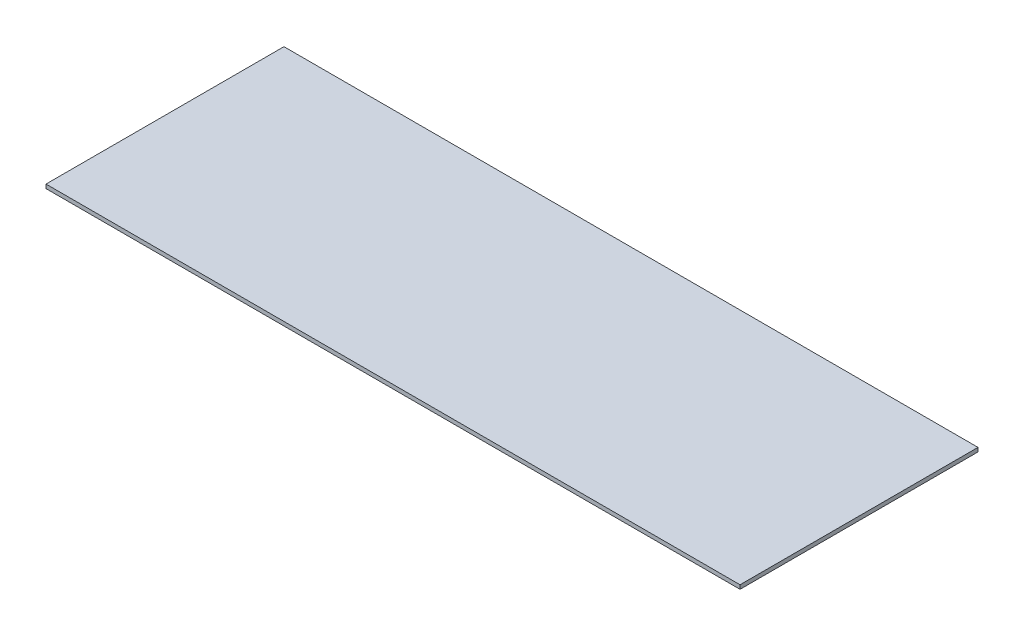
ISO-10303-21;
HEADER;
FILE_DESCRIPTION(('STEP AP214'),'2;1');
FILE_NAME('part.step','',(''),(''),'','','');
FILE_SCHEMA(('AUTOMOTIVE_DESIGN { 1 0 10303 214 1 1 1 1 }'));
ENDSEC;
DATA;
#1=APPLICATION_CONTEXT('core data for automotive mechanical design processes');
#2=APPLICATION_PROTOCOL_DEFINITION('international standard','automotive_design',2000,#1);
#3=PRODUCT_CONTEXT('',#1,'mechanical');
#4=PRODUCT('Part','Part','',(#3));
#5=PRODUCT_RELATED_PRODUCT_CATEGORY('part','',(#4));
#6=PRODUCT_DEFINITION_FORMATION('','',#4);
#7=PRODUCT_DEFINITION_CONTEXT('part definition',#1,'design');
#8=PRODUCT_DEFINITION('design','',#6,#7);
#9=PRODUCT_DEFINITION_SHAPE('','',#8);
#10=(LENGTH_UNIT() NAMED_UNIT(*) SI_UNIT(.MILLI.,.METRE.));
#11=(NAMED_UNIT(*) PLANE_ANGLE_UNIT() SI_UNIT($,.RADIAN.));
#12=(NAMED_UNIT(*) SI_UNIT($,.STERADIAN.) SOLID_ANGLE_UNIT());
#13=UNCERTAINTY_MEASURE_WITH_UNIT(LENGTH_MEASURE(1.E-05),#10,'distance_accuracy_value','');
#14=(GEOMETRIC_REPRESENTATION_CONTEXT(3) GLOBAL_UNCERTAINTY_ASSIGNED_CONTEXT((#13)) GLOBAL_UNIT_ASSIGNED_CONTEXT((#10,
#11,#12)) REPRESENTATION_CONTEXT('',''));
#15=CARTESIAN_POINT('',(0.,0.,0.));
#16=DIRECTION('',(0.,0.,1.));
#17=DIRECTION('',(1.,0.,0.));
#18=AXIS2_PLACEMENT_3D('',#15,#16,#17);
#19=CARTESIAN_POINT('',(-192.808988764045,2.,-60.3370786516853));
#20=DIRECTION('',(0.,0.,-1.));
#21=DIRECTION('',(-1.,0.,0.));
#22=AXIS2_PLACEMENT_3D('',#19,#20,#21);
#23=PLANE('',#22);
#24=DIRECTION('',(1.,0.,0.));
#25=VECTOR('',#24,1.);
#26=CARTESIAN_POINT('',(-192.808988764045,0.,-60.3370786516853));
#27=LINE('',#26,#25);
#28=CARTESIAN_POINT('',(-192.808988764045,0.,-60.3370786516853));
#29=VERTEX_POINT('',#28);
#30=CARTESIAN_POINT('',(157.191011235955,0.,-60.3370786516853));
#31=VERTEX_POINT('',#30);
#32=EDGE_CURVE('E102',#29,#31,#27,.T.);
#33=ORIENTED_EDGE('',*,*,#32,.F.);
#34=DIRECTION('',(0.,-1.,0.));
#35=VECTOR('',#34,1.);
#36=CARTESIAN_POINT('',(-192.808988764045,2.,-60.3370786516853));
#37=LINE('',#36,#35);
#38=CARTESIAN_POINT('',(-192.808988764045,2.,-60.3370786516853));
#39=VERTEX_POINT('',#38);
#40=EDGE_CURVE('E11',#39,#29,#37,.T.);
#41=ORIENTED_EDGE('',*,*,#40,.F.);
#42=DIRECTION('',(1.,0.,0.));
#43=VECTOR('',#42,1.);
#44=CARTESIAN_POINT('',(-192.808988764045,2.,-60.3370786516853));
#45=LINE('',#44,#43);
#46=CARTESIAN_POINT('',(157.191011235955,2.,-60.3370786516853));
#47=VERTEX_POINT('',#46);
#48=EDGE_CURVE('E97',#39,#47,#45,.T.);
#49=ORIENTED_EDGE('',*,*,#48,.T.);
#50=DIRECTION('',(0.,-1.,0.));
#51=VECTOR('',#50,1.);
#52=CARTESIAN_POINT('',(157.191011235955,2.,-60.3370786516853));
#53=LINE('',#52,#51);
#54=EDGE_CURVE('E40',#47,#31,#53,.T.);
#55=ORIENTED_EDGE('',*,*,#54,.T.);
#56=EDGE_LOOP('',(#33,#41,#49,#55));
#57=FACE_BOUND('',#56,.T.);
#58=ADVANCED_FACE('F37',(#57),#23,.T.);
#59=CARTESIAN_POINT('',(-192.808988764045,2.,-60.3370786516853));
#60=DIRECTION('',(1.,0.,0.));
#61=DIRECTION('',(0.,0.,-1.));
#62=AXIS2_PLACEMENT_3D('',#59,#60,#61);
#63=PLANE('',#62);
#64=DIRECTION('',(0.,0.,1.));
#65=VECTOR('',#64,1.);
#66=CARTESIAN_POINT('',(-192.808988764045,0.,-60.3370786516853));
#67=LINE('',#66,#65);
#68=CARTESIAN_POINT('',(-192.808988764045,0.,59.6629213483147));
#69=VERTEX_POINT('',#68);
#70=EDGE_CURVE('E70',#29,#69,#67,.T.);
#71=ORIENTED_EDGE('',*,*,#70,.T.);
#72=DIRECTION('',(0.,-1.,0.));
#73=VECTOR('',#72,1.);
#74=CARTESIAN_POINT('',(-192.808988764045,2.,59.6629213483147));
#75=LINE('',#74,#73);
#76=CARTESIAN_POINT('',(-192.808988764045,2.,59.6629213483147));
#77=VERTEX_POINT('',#76);
#78=EDGE_CURVE('E46',#77,#69,#75,.T.);
#79=ORIENTED_EDGE('',*,*,#78,.F.);
#80=DIRECTION('',(0.,0.,1.));
#81=VECTOR('',#80,1.);
#82=CARTESIAN_POINT('',(-192.808988764045,2.,-60.3370786516853));
#83=LINE('',#82,#81);
#84=EDGE_CURVE('E87',#39,#77,#83,.T.);
#85=ORIENTED_EDGE('',*,*,#84,.F.);
#86=ORIENTED_EDGE('',*,*,#40,.T.);
#87=EDGE_LOOP('',(#71,#79,#85,#86));
#88=FACE_BOUND('',#87,.T.);
#89=ADVANCED_FACE('F112',(#88),#63,.F.);
#90=CARTESIAN_POINT('',(-192.808988764045,2.,59.6629213483147));
#91=DIRECTION('',(0.,0.,-1.));
#92=DIRECTION('',(-1.,0.,0.));
#93=AXIS2_PLACEMENT_3D('',#90,#91,#92);
#94=PLANE('',#93);
#95=DIRECTION('',(1.,0.,0.));
#96=VECTOR('',#95,1.);
#97=CARTESIAN_POINT('',(-192.808988764045,0.,59.6629213483147));
#98=LINE('',#97,#96);
#99=CARTESIAN_POINT('',(157.191011235955,0.,59.6629213483147));
#100=VERTEX_POINT('',#99);
#101=EDGE_CURVE('E94',#69,#100,#98,.T.);
#102=ORIENTED_EDGE('',*,*,#101,.T.);
#103=DIRECTION('',(0.,-1.,0.));
#104=VECTOR('',#103,1.);
#105=CARTESIAN_POINT('',(157.191011235955,2.,59.6629213483147));
#106=LINE('',#105,#104);
#107=CARTESIAN_POINT('',(157.191011235955,2.,59.6629213483147));
#108=VERTEX_POINT('',#107);
#109=EDGE_CURVE('E91',#108,#100,#106,.T.);
#110=ORIENTED_EDGE('',*,*,#109,.F.);
#111=DIRECTION('',(1.,0.,0.));
#112=VECTOR('',#111,1.);
#113=CARTESIAN_POINT('',(-192.808988764045,2.,59.6629213483147));
#114=LINE('',#113,#112);
#115=EDGE_CURVE('E82',#77,#108,#114,.T.);
#116=ORIENTED_EDGE('',*,*,#115,.F.);
#117=ORIENTED_EDGE('',*,*,#78,.T.);
#118=EDGE_LOOP('',(#102,#110,#116,#117));
#119=FACE_BOUND('',#118,.T.);
#120=ADVANCED_FACE('F92',(#119),#94,.F.);
#121=CARTESIAN_POINT('',(157.191011235955,2.,-60.3370786516853));
#122=DIRECTION('',(1.,0.,0.));
#123=DIRECTION('',(0.,0.,-1.));
#124=AXIS2_PLACEMENT_3D('',#121,#122,#123);
#125=PLANE('',#124);
#126=DIRECTION('',(0.,0.,1.));
#127=VECTOR('',#126,1.);
#128=CARTESIAN_POINT('',(157.191011235955,0.,-60.3370786516853));
#129=LINE('',#128,#127);
#130=EDGE_CURVE('E105',#31,#100,#129,.T.);
#131=ORIENTED_EDGE('',*,*,#130,.F.);
#132=ORIENTED_EDGE('',*,*,#54,.F.);
#133=DIRECTION('',(0.,0.,1.));
#134=VECTOR('',#133,1.);
#135=CARTESIAN_POINT('',(157.191011235955,2.,-60.3370786516853));
#136=LINE('',#135,#134);
#137=EDGE_CURVE('E86',#47,#108,#136,.T.);
#138=ORIENTED_EDGE('',*,*,#137,.T.);
#139=ORIENTED_EDGE('',*,*,#109,.T.);
#140=EDGE_LOOP('',(#131,#132,#138,#139));
#141=FACE_BOUND('',#140,.T.);
#142=ADVANCED_FACE('F96',(#141),#125,.T.);
#143=CARTESIAN_POINT('',(0.,2.,0.));
#144=DIRECTION('',(0.,-1.,0.));
#145=DIRECTION('',(0.,0.,-1.));
#146=AXIS2_PLACEMENT_3D('',#143,#144,#145);
#147=PLANE('',#146);
#148=ORIENTED_EDGE('',*,*,#48,.F.);
#149=ORIENTED_EDGE('',*,*,#84,.T.);
#150=ORIENTED_EDGE('',*,*,#115,.T.);
#151=ORIENTED_EDGE('',*,*,#137,.F.);
#152=EDGE_LOOP('',(#148,#149,#150,#151));
#153=FACE_BOUND('',#152,.T.);
#154=ADVANCED_FACE('F85',(#153),#147,.F.);
#155=CARTESIAN_POINT('',(0.,0.,0.));
#156=DIRECTION('',(0.,-1.,0.));
#157=DIRECTION('',(0.,0.,-1.));
#158=AXIS2_PLACEMENT_3D('',#155,#156,#157);
#159=PLANE('',#158);
#160=ORIENTED_EDGE('',*,*,#32,.T.);
#161=ORIENTED_EDGE('',*,*,#130,.T.);
#162=ORIENTED_EDGE('',*,*,#101,.F.);
#163=ORIENTED_EDGE('',*,*,#70,.F.);
#164=EDGE_LOOP('',(#160,#161,#162,#163));
#165=FACE_BOUND('',#164,.T.);
#166=ADVANCED_FACE('F110',(#165),#159,.T.);
#167=CLOSED_SHELL('',(#58,#89,#120,#142,#154,#166));
#168=MANIFOLD_SOLID_BREP('B2',#167);
#169=ADVANCED_BREP_SHAPE_REPRESENTATION('',(#18,#168),#14);
#170=SHAPE_DEFINITION_REPRESENTATION(#9,#169);
ENDSEC;
END-ISO-10303-21;
